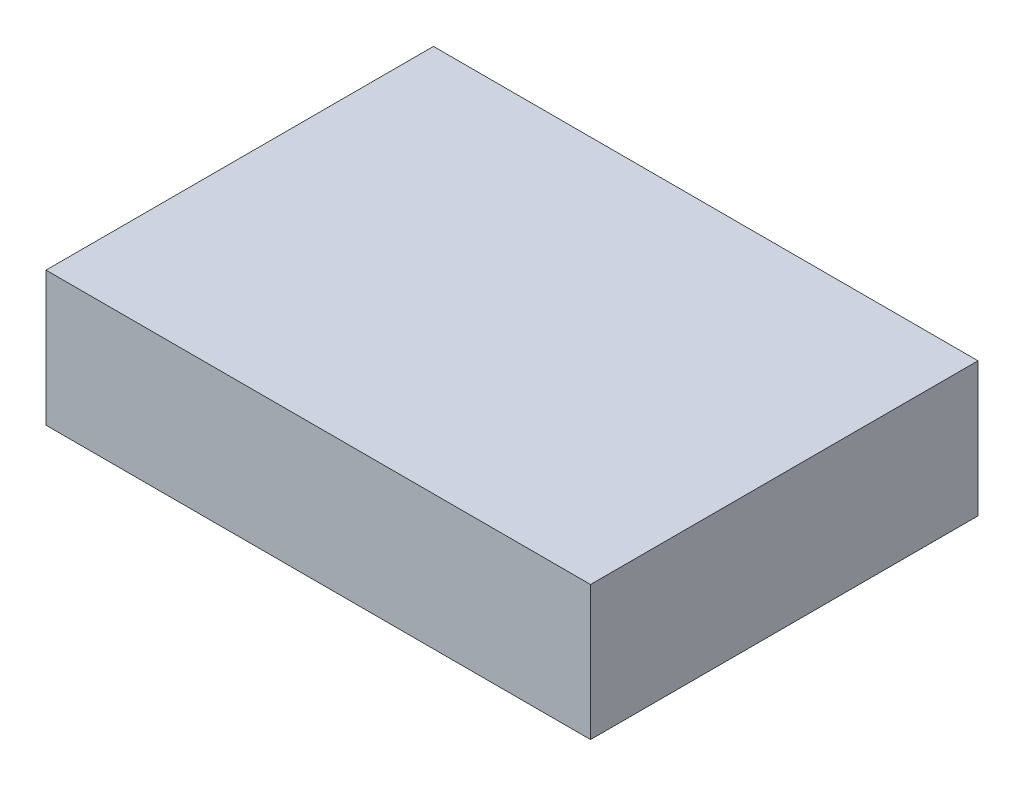
ISO-10303-21;
HEADER;
FILE_DESCRIPTION(('STEP AP214'),'2;1');
FILE_NAME('part.step','',(''),(''),'','','');
FILE_SCHEMA(('AUTOMOTIVE_DESIGN { 1 0 10303 214 1 1 1 1 }'));
ENDSEC;
DATA;
#1=APPLICATION_CONTEXT('core data for automotive mechanical design processes');
#2=APPLICATION_PROTOCOL_DEFINITION('international standard','automotive_design',2000,#1);
#3=PRODUCT_CONTEXT('',#1,'mechanical');
#4=PRODUCT('Part','Part','',(#3));
#5=PRODUCT_RELATED_PRODUCT_CATEGORY('part','',(#4));
#6=PRODUCT_DEFINITION_FORMATION('','',#4);
#7=PRODUCT_DEFINITION_CONTEXT('part definition',#1,'design');
#8=PRODUCT_DEFINITION('design','',#6,#7);
#9=PRODUCT_DEFINITION_SHAPE('','',#8);
#10=(LENGTH_UNIT() NAMED_UNIT(*) SI_UNIT(.MILLI.,.METRE.));
#11=(NAMED_UNIT(*) PLANE_ANGLE_UNIT() SI_UNIT($,.RADIAN.));
#12=(NAMED_UNIT(*) SI_UNIT($,.STERADIAN.) SOLID_ANGLE_UNIT());
#13=UNCERTAINTY_MEASURE_WITH_UNIT(LENGTH_MEASURE(1.E-05),#10,'distance_accuracy_value','');
#14=(GEOMETRIC_REPRESENTATION_CONTEXT(3) GLOBAL_UNCERTAINTY_ASSIGNED_CONTEXT((#13)) GLOBAL_UNIT_ASSIGNED_CONTEXT((#10,
#11,#12)) REPRESENTATION_CONTEXT('',''));
#15=CARTESIAN_POINT('',(0.,0.,0.));
#16=DIRECTION('',(0.,0.,1.));
#17=DIRECTION('',(1.,0.,0.));
#18=AXIS2_PLACEMENT_3D('',#15,#16,#17);
#19=CARTESIAN_POINT('',(26.35,13.,18.75));
#20=DIRECTION('',(-1.,0.,0.));
#21=DIRECTION('',(0.,0.,1.));
#22=AXIS2_PLACEMENT_3D('',#19,#20,#21);
#23=PLANE('',#22);
#24=DIRECTION('',(0.,0.,-1.));
#25=VECTOR('',#24,1.);
#26=CARTESIAN_POINT('',(26.35,0.,18.75));
#27=LINE('',#26,#25);
#28=CARTESIAN_POINT('',(26.35,0.,18.75));
#29=VERTEX_POINT('',#28);
#30=CARTESIAN_POINT('',(26.35,0.,-18.75));
#31=VERTEX_POINT('',#30);
#32=EDGE_CURVE('E100',#29,#31,#27,.T.);
#33=ORIENTED_EDGE('',*,*,#32,.T.);
#34=DIRECTION('',(0.,-1.,0.));
#35=VECTOR('',#34,1.);
#36=CARTESIAN_POINT('',(26.35,13.,-18.75));
#37=LINE('',#36,#35);
#38=CARTESIAN_POINT('',(26.35,13.,-18.75));
#39=VERTEX_POINT('',#38);
#40=EDGE_CURVE('E11',#39,#31,#37,.T.);
#41=ORIENTED_EDGE('',*,*,#40,.F.);
#42=DIRECTION('',(0.,0.,-1.));
#43=VECTOR('',#42,1.);
#44=CARTESIAN_POINT('',(26.35,13.,18.75));
#45=LINE('',#44,#43);
#46=CARTESIAN_POINT('',(26.35,13.,18.75));
#47=VERTEX_POINT('',#46);
#48=EDGE_CURVE('E88',#47,#39,#45,.T.);
#49=ORIENTED_EDGE('',*,*,#48,.F.);
#50=DIRECTION('',(0.,-1.,0.));
#51=VECTOR('',#50,1.);
#52=CARTESIAN_POINT('',(26.35,13.,18.75));
#53=LINE('',#52,#51);
#54=EDGE_CURVE('E96',#47,#29,#53,.T.);
#55=ORIENTED_EDGE('',*,*,#54,.T.);
#56=EDGE_LOOP('',(#33,#41,#49,#55));
#57=FACE_BOUND('',#56,.T.);
#58=ADVANCED_FACE('F37',(#57),#23,.F.);
#59=CARTESIAN_POINT('',(-26.35,13.,-18.75));
#60=DIRECTION('',(0.,0.,1.));
#61=DIRECTION('',(1.,0.,0.));
#62=AXIS2_PLACEMENT_3D('',#59,#60,#61);
#63=PLANE('',#62);
#64=DIRECTION('',(-1.,0.,0.));
#65=VECTOR('',#64,1.);
#66=CARTESIAN_POINT('',(-26.35,0.,-18.75));
#67=LINE('',#66,#65);
#68=CARTESIAN_POINT('',(-26.35,0.,-18.75));
#69=VERTEX_POINT('',#68);
#70=EDGE_CURVE('E92',#31,#69,#67,.T.);
#71=ORIENTED_EDGE('',*,*,#70,.T.);
#72=DIRECTION('',(0.,-1.,0.));
#73=VECTOR('',#72,1.);
#74=CARTESIAN_POINT('',(-26.35,13.,-18.75));
#75=LINE('',#74,#73);
#76=CARTESIAN_POINT('',(-26.35,13.,-18.75));
#77=VERTEX_POINT('',#76);
#78=EDGE_CURVE('E45',#77,#69,#75,.T.);
#79=ORIENTED_EDGE('',*,*,#78,.F.);
#80=DIRECTION('',(-1.,0.,0.));
#81=VECTOR('',#80,1.);
#82=CARTESIAN_POINT('',(-26.35,13.,-18.75));
#83=LINE('',#82,#81);
#84=EDGE_CURVE('E83',#39,#77,#83,.T.);
#85=ORIENTED_EDGE('',*,*,#84,.F.);
#86=ORIENTED_EDGE('',*,*,#40,.T.);
#87=EDGE_LOOP('',(#71,#79,#85,#86));
#88=FACE_BOUND('',#87,.T.);
#89=ADVANCED_FACE('F91',(#88),#63,.F.);
#90=CARTESIAN_POINT('',(-26.35,13.,18.75));
#91=DIRECTION('',(1.,0.,0.));
#92=DIRECTION('',(0.,0.,-1.));
#93=AXIS2_PLACEMENT_3D('',#90,#91,#92);
#94=PLANE('',#93);
#95=DIRECTION('',(0.,0.,1.));
#96=VECTOR('',#95,1.);
#97=CARTESIAN_POINT('',(-26.35,0.,18.75));
#98=LINE('',#97,#96);
#99=CARTESIAN_POINT('',(-26.35,0.,18.75));
#100=VERTEX_POINT('',#99);
#101=EDGE_CURVE('E70',#69,#100,#98,.T.);
#102=ORIENTED_EDGE('',*,*,#101,.T.);
#103=DIRECTION('',(0.,-1.,0.));
#104=VECTOR('',#103,1.);
#105=CARTESIAN_POINT('',(-26.35,13.,18.75));
#106=LINE('',#105,#104);
#107=CARTESIAN_POINT('',(-26.35,13.,18.75));
#108=VERTEX_POINT('',#107);
#109=EDGE_CURVE('E93',#108,#100,#106,.T.);
#110=ORIENTED_EDGE('',*,*,#109,.F.);
#111=DIRECTION('',(0.,0.,1.));
#112=VECTOR('',#111,1.);
#113=CARTESIAN_POINT('',(-26.35,13.,18.75));
#114=LINE('',#113,#112);
#115=EDGE_CURVE('E86',#77,#108,#114,.T.);
#116=ORIENTED_EDGE('',*,*,#115,.F.);
#117=ORIENTED_EDGE('',*,*,#78,.T.);
#118=EDGE_LOOP('',(#102,#110,#116,#117));
#119=FACE_BOUND('',#118,.T.);
#120=ADVANCED_FACE('F94',(#119),#94,.F.);
#121=CARTESIAN_POINT('',(-26.35,13.,18.75));
#122=DIRECTION('',(0.,0.,-1.));
#123=DIRECTION('',(-1.,0.,0.));
#124=AXIS2_PLACEMENT_3D('',#121,#122,#123);
#125=PLANE('',#124);
#126=DIRECTION('',(1.,0.,0.));
#127=VECTOR('',#126,1.);
#128=CARTESIAN_POINT('',(-26.35,0.,18.75));
#129=LINE('',#128,#127);
#130=EDGE_CURVE('E76',#100,#29,#129,.T.);
#131=ORIENTED_EDGE('',*,*,#130,.T.);
#132=ORIENTED_EDGE('',*,*,#54,.F.);
#133=DIRECTION('',(1.,0.,0.));
#134=VECTOR('',#133,1.);
#135=CARTESIAN_POINT('',(-26.35,13.,18.75));
#136=LINE('',#135,#134);
#137=EDGE_CURVE('E53',#108,#47,#136,.T.);
#138=ORIENTED_EDGE('',*,*,#137,.F.);
#139=ORIENTED_EDGE('',*,*,#109,.T.);
#140=EDGE_LOOP('',(#131,#132,#138,#139));
#141=FACE_BOUND('',#140,.T.);
#142=ADVANCED_FACE('F107',(#141),#125,.F.);
#143=CARTESIAN_POINT('',(0.,13.,0.));
#144=DIRECTION('',(0.,-1.,0.));
#145=DIRECTION('',(0.,0.,-1.));
#146=AXIS2_PLACEMENT_3D('',#143,#144,#145);
#147=PLANE('',#146);
#148=ORIENTED_EDGE('',*,*,#48,.T.);
#149=ORIENTED_EDGE('',*,*,#84,.T.);
#150=ORIENTED_EDGE('',*,*,#115,.T.);
#151=ORIENTED_EDGE('',*,*,#137,.T.);
#152=EDGE_LOOP('',(#148,#149,#150,#151));
#153=FACE_BOUND('',#152,.T.);
#154=ADVANCED_FACE('F84',(#153),#147,.F.);
#155=CARTESIAN_POINT('',(0.,0.,0.));
#156=DIRECTION('',(0.,-1.,0.));
#157=DIRECTION('',(0.,0.,-1.));
#158=AXIS2_PLACEMENT_3D('',#155,#156,#157);
#159=PLANE('',#158);
#160=ORIENTED_EDGE('',*,*,#32,.F.);
#161=ORIENTED_EDGE('',*,*,#130,.F.);
#162=ORIENTED_EDGE('',*,*,#101,.F.);
#163=ORIENTED_EDGE('',*,*,#70,.F.);
#164=EDGE_LOOP('',(#160,#161,#162,#163));
#165=FACE_BOUND('',#164,.T.);
#166=ADVANCED_FACE('F110',(#165),#159,.T.);
#167=CLOSED_SHELL('',(#58,#89,#120,#142,#154,#166));
#168=MANIFOLD_SOLID_BREP('B2',#167);
#169=ADVANCED_BREP_SHAPE_REPRESENTATION('',(#18,#168),#14);
#170=SHAPE_DEFINITION_REPRESENTATION(#9,#169);
ENDSEC;
END-ISO-10303-21;
